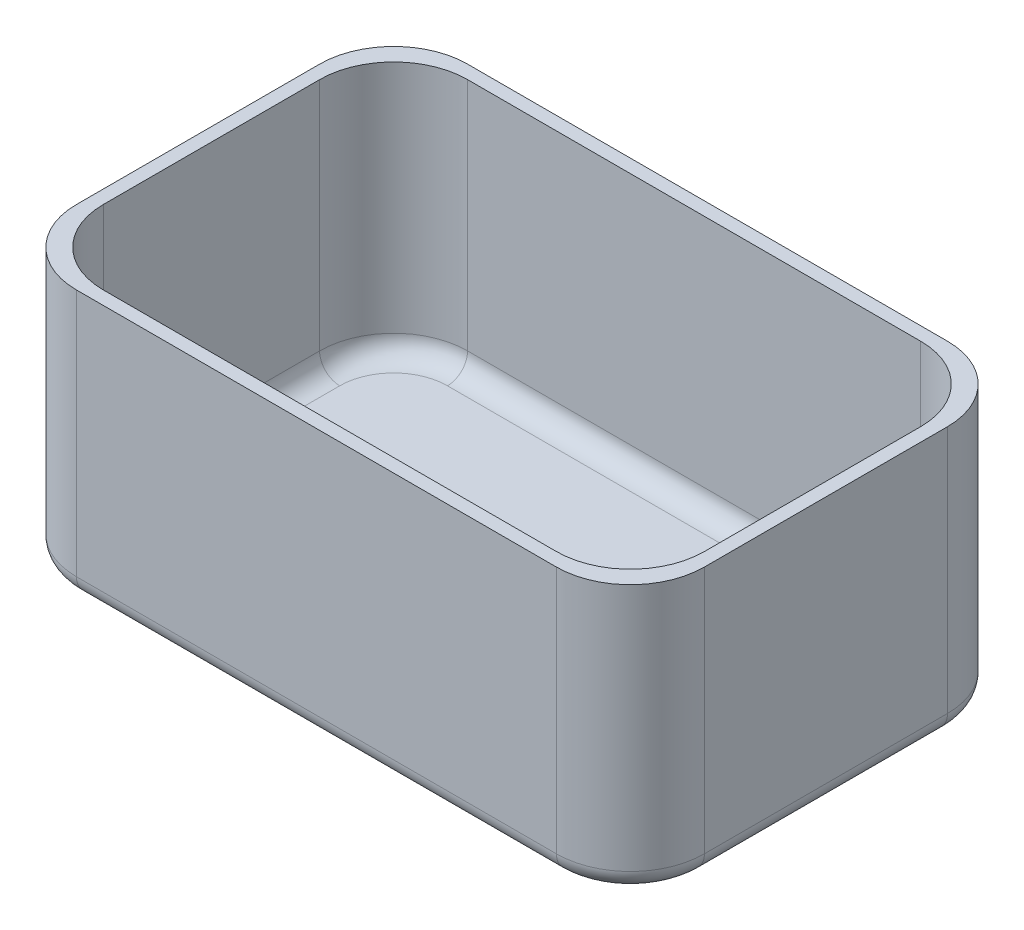
ISO-10303-21;
HEADER;
FILE_DESCRIPTION(('STEP AP214'),'2;1');
FILE_NAME('part.step','',(''),(''),'','','');
FILE_SCHEMA(('AUTOMOTIVE_DESIGN { 1 0 10303 214 1 1 1 1 }'));
ENDSEC;
DATA;
#1=APPLICATION_CONTEXT('core data for automotive mechanical design processes');
#2=APPLICATION_PROTOCOL_DEFINITION('international standard','automotive_design',2000,#1);
#3=PRODUCT_CONTEXT('',#1,'mechanical');
#4=PRODUCT('Part','Part','',(#3));
#5=PRODUCT_RELATED_PRODUCT_CATEGORY('part','',(#4));
#6=PRODUCT_DEFINITION_FORMATION('','',#4);
#7=PRODUCT_DEFINITION_CONTEXT('part definition',#1,'design');
#8=PRODUCT_DEFINITION('design','',#6,#7);
#9=PRODUCT_DEFINITION_SHAPE('','',#8);
#10=(LENGTH_UNIT() NAMED_UNIT(*) SI_UNIT(.MILLI.,.METRE.));
#11=(NAMED_UNIT(*) PLANE_ANGLE_UNIT() SI_UNIT($,.RADIAN.));
#12=(NAMED_UNIT(*) SI_UNIT($,.STERADIAN.) SOLID_ANGLE_UNIT());
#13=UNCERTAINTY_MEASURE_WITH_UNIT(LENGTH_MEASURE(1.E-05),#10,'distance_accuracy_value','');
#14=(GEOMETRIC_REPRESENTATION_CONTEXT(3) GLOBAL_UNCERTAINTY_ASSIGNED_CONTEXT((#13)) GLOBAL_UNIT_ASSIGNED_CONTEXT((#10,
#11,#12)) REPRESENTATION_CONTEXT('',''));
#15=CARTESIAN_POINT('',(0.,0.,0.));
#16=DIRECTION('',(0.,0.,1.));
#17=DIRECTION('',(1.,0.,0.));
#18=AXIS2_PLACEMENT_3D('',#15,#16,#17);
#19=CARTESIAN_POINT('',(287.475,9.52500000000001,0.));
#20=DIRECTION('',(0.,0.,-1.));
#21=DIRECTION('',(-1.,0.,0.));
#22=AXIS2_PLACEMENT_3D('',#19,#20,#21);
#23=CYLINDRICAL_SURFACE('',#22,9.525);
#24=CARTESIAN_POINT('',(287.475,9.52500000000001,-150.));
#25=DIRECTION('',(0.,0.,-1.));
#26=DIRECTION('',(-1.,0.,0.));
#27=AXIS2_PLACEMENT_3D('',#24,#25,#26);
#28=CIRCLE('',#27,9.525);
#29=CARTESIAN_POINT('',(297.,9.52500000000001,-150.));
#30=VERTEX_POINT('',#29);
#31=CARTESIAN_POINT('',(287.475,0.,-150.));
#32=VERTEX_POINT('',#31);
#33=EDGE_CURVE('E12',#30,#32,#28,.T.);
#34=ORIENTED_EDGE('',*,*,#33,.F.);
#35=DIRECTION('',(0.,0.,-1.));
#36=VECTOR('',#35,1.);
#37=CARTESIAN_POINT('',(297.,9.52500000000001,0.));
#38=LINE('',#37,#36);
#39=CARTESIAN_POINT('',(297.,9.52500000000001,-35.));
#40=VERTEX_POINT('',#39);
#41=EDGE_CURVE('E404',#40,#30,#38,.T.);
#42=ORIENTED_EDGE('',*,*,#41,.F.);
#43=CARTESIAN_POINT('',(287.475,9.52500000000001,-35.));
#44=DIRECTION('',(0.,0.,-1.));
#45=DIRECTION('',(-1.,0.,0.));
#46=AXIS2_PLACEMENT_3D('',#43,#44,#45);
#47=CIRCLE('',#46,9.525);
#48=CARTESIAN_POINT('',(287.475,0.,-35.));
#49=VERTEX_POINT('',#48);
#50=EDGE_CURVE('E53',#40,#49,#47,.T.);
#51=ORIENTED_EDGE('',*,*,#50,.T.);
#52=DIRECTION('',(0.,0.,-1.));
#53=VECTOR('',#52,1.);
#54=CARTESIAN_POINT('',(287.475,0.,0.));
#55=LINE('',#54,#53);
#56=EDGE_CURVE('E353',#32,#49,#55,.F.);
#57=ORIENTED_EDGE('',*,*,#56,.F.);
#58=EDGE_LOOP('',(#34,#42,#51,#57));
#59=FACE_BOUND('',#58,.T.);
#60=ADVANCED_FACE('F45',(#59),#23,.T.);
#61=CARTESIAN_POINT('',(262.,9.52500000000001,-35.));
#62=DIRECTION('',(0.,1.,0.));
#63=DIRECTION('',(0.,0.,1.));
#64=AXIS2_PLACEMENT_3D('',#61,#62,#63);
#65=TOROIDAL_SURFACE('',#64,25.475,9.525);
#66=ORIENTED_EDGE('',*,*,#50,.F.);
#67=CARTESIAN_POINT('',(262.,9.52500000000001,-35.));
#68=DIRECTION('',(0.,1.,0.));
#69=DIRECTION('',(0.,0.,1.));
#70=AXIS2_PLACEMENT_3D('',#67,#68,#69);
#71=CIRCLE('',#70,35.);
#72=CARTESIAN_POINT('',(262.,9.52500000000001,0.));
#73=VERTEX_POINT('',#72);
#74=EDGE_CURVE('E401',#73,#40,#71,.T.);
#75=ORIENTED_EDGE('',*,*,#74,.F.);
#76=CARTESIAN_POINT('',(262.,9.52500000000001,-9.525));
#77=DIRECTION('',(1.,0.,0.));
#78=DIRECTION('',(0.,0.,-1.));
#79=AXIS2_PLACEMENT_3D('',#76,#77,#78);
#80=CIRCLE('',#79,9.525);
#81=CARTESIAN_POINT('',(262.,0.,-9.525));
#82=VERTEX_POINT('',#81);
#83=EDGE_CURVE('E417',#73,#82,#80,.T.);
#84=ORIENTED_EDGE('',*,*,#83,.T.);
#85=CARTESIAN_POINT('',(262.,0.,-35.));
#86=DIRECTION('',(0.,1.,0.));
#87=DIRECTION('',(0.,0.,1.));
#88=AXIS2_PLACEMENT_3D('',#85,#86,#87);
#89=CIRCLE('',#88,25.475);
#90=EDGE_CURVE('E358',#49,#82,#89,.F.);
#91=ORIENTED_EDGE('',*,*,#90,.F.);
#92=EDGE_LOOP('',(#66,#75,#84,#91));
#93=FACE_BOUND('',#92,.T.);
#94=ADVANCED_FACE('F418',(#93),#65,.T.);
#95=CARTESIAN_POINT('',(0.,9.52500000000001,-9.525));
#96=DIRECTION('',(1.,0.,0.));
#97=DIRECTION('',(0.,0.,-1.));
#98=AXIS2_PLACEMENT_3D('',#95,#96,#97);
#99=CYLINDRICAL_SURFACE('',#98,9.525);
#100=ORIENTED_EDGE('',*,*,#83,.F.);
#101=DIRECTION('',(1.,0.,0.));
#102=VECTOR('',#101,1.);
#103=CARTESIAN_POINT('',(0.,9.52500000000001,0.));
#104=LINE('',#103,#102);
#105=CARTESIAN_POINT('',(35.,9.52500000000001,0.));
#106=VERTEX_POINT('',#105);
#107=EDGE_CURVE('E398',#106,#73,#104,.T.);
#108=ORIENTED_EDGE('',*,*,#107,.F.);
#109=CARTESIAN_POINT('',(35.,9.52500000000001,-9.525));
#110=DIRECTION('',(1.,0.,0.));
#111=DIRECTION('',(0.,0.,-1.));
#112=AXIS2_PLACEMENT_3D('',#109,#110,#111);
#113=CIRCLE('',#112,9.525);
#114=CARTESIAN_POINT('',(35.,0.,-9.525));
#115=VERTEX_POINT('',#114);
#116=EDGE_CURVE('E415',#106,#115,#113,.T.);
#117=ORIENTED_EDGE('',*,*,#116,.T.);
#118=DIRECTION('',(1.,0.,0.));
#119=VECTOR('',#118,1.);
#120=CARTESIAN_POINT('',(0.,0.,-9.525));
#121=LINE('',#120,#119);
#122=EDGE_CURVE('E361',#82,#115,#121,.F.);
#123=ORIENTED_EDGE('',*,*,#122,.F.);
#124=EDGE_LOOP('',(#100,#108,#117,#123));
#125=FACE_BOUND('',#124,.T.);
#126=ADVANCED_FACE('F563',(#125),#99,.T.);
#127=CARTESIAN_POINT('',(35.,9.52500000000001,-35.));
#128=DIRECTION('',(0.,1.,0.));
#129=DIRECTION('',(0.,0.,1.));
#130=AXIS2_PLACEMENT_3D('',#127,#128,#129);
#131=TOROIDAL_SURFACE('',#130,25.475,9.525);
#132=ORIENTED_EDGE('',*,*,#116,.F.);
#133=CARTESIAN_POINT('',(35.,9.52500000000001,-35.));
#134=DIRECTION('',(0.,1.,0.));
#135=DIRECTION('',(0.,0.,1.));
#136=AXIS2_PLACEMENT_3D('',#133,#134,#135);
#137=CIRCLE('',#136,35.);
#138=CARTESIAN_POINT('',(0.,9.52500000000001,-35.));
#139=VERTEX_POINT('',#138);
#140=EDGE_CURVE('E395',#139,#106,#137,.T.);
#141=ORIENTED_EDGE('',*,*,#140,.F.);
#142=CARTESIAN_POINT('',(9.525,9.52500000000001,-35.));
#143=DIRECTION('',(0.,0.,1.));
#144=DIRECTION('',(1.,0.,0.));
#145=AXIS2_PLACEMENT_3D('',#142,#143,#144);
#146=CIRCLE('',#145,9.525);
#147=CARTESIAN_POINT('',(9.525,0.,-35.));
#148=VERTEX_POINT('',#147);
#149=EDGE_CURVE('E413',#139,#148,#146,.T.);
#150=ORIENTED_EDGE('',*,*,#149,.T.);
#151=CARTESIAN_POINT('',(35.,0.,-35.));
#152=DIRECTION('',(0.,1.,0.));
#153=DIRECTION('',(0.,0.,1.));
#154=AXIS2_PLACEMENT_3D('',#151,#152,#153);
#155=CIRCLE('',#154,25.475);
#156=EDGE_CURVE('E364',#115,#148,#155,.F.);
#157=ORIENTED_EDGE('',*,*,#156,.F.);
#158=EDGE_LOOP('',(#132,#141,#150,#157));
#159=FACE_BOUND('',#158,.T.);
#160=ADVANCED_FACE('F568',(#159),#131,.T.);
#161=CARTESIAN_POINT('',(9.525,9.52500000000001,0.));
#162=DIRECTION('',(0.,0.,-1.));
#163=DIRECTION('',(-1.,0.,0.));
#164=AXIS2_PLACEMENT_3D('',#161,#162,#163);
#165=CYLINDRICAL_SURFACE('',#164,9.525);
#166=ORIENTED_EDGE('',*,*,#149,.F.);
#167=DIRECTION('',(0.,0.,1.));
#168=VECTOR('',#167,1.);
#169=CARTESIAN_POINT('',(0.,9.52500000000001,0.));
#170=LINE('',#169,#168);
#171=CARTESIAN_POINT('',(0.,9.52500000000001,-150.));
#172=VERTEX_POINT('',#171);
#173=EDGE_CURVE('E385',#172,#139,#170,.T.);
#174=ORIENTED_EDGE('',*,*,#173,.F.);
#175=CARTESIAN_POINT('',(9.525,9.52500000000001,-150.));
#176=DIRECTION('',(0.,0.,1.));
#177=DIRECTION('',(1.,0.,0.));
#178=AXIS2_PLACEMENT_3D('',#175,#176,#177);
#179=CIRCLE('',#178,9.525);
#180=CARTESIAN_POINT('',(9.525,0.,-150.));
#181=VERTEX_POINT('',#180);
#182=EDGE_CURVE('E409',#172,#181,#179,.T.);
#183=ORIENTED_EDGE('',*,*,#182,.T.);
#184=DIRECTION('',(0.,0.,1.));
#185=VECTOR('',#184,1.);
#186=CARTESIAN_POINT('',(9.525,0.,0.));
#187=LINE('',#186,#185);
#188=EDGE_CURVE('E367',#148,#181,#187,.F.);
#189=ORIENTED_EDGE('',*,*,#188,.F.);
#190=EDGE_LOOP('',(#166,#174,#183,#189));
#191=FACE_BOUND('',#190,.T.);
#192=ADVANCED_FACE('F572',(#191),#165,.T.);
#193=CARTESIAN_POINT('',(35.,9.52500000000001,-150.));
#194=DIRECTION('',(0.,1.,0.));
#195=DIRECTION('',(0.,0.,1.));
#196=AXIS2_PLACEMENT_3D('',#193,#194,#195);
#197=TOROIDAL_SURFACE('',#196,25.475,9.525);
#198=ORIENTED_EDGE('',*,*,#182,.F.);
#199=CARTESIAN_POINT('',(35.,9.52500000000001,-150.));
#200=DIRECTION('',(0.,1.,0.));
#201=DIRECTION('',(0.,0.,1.));
#202=AXIS2_PLACEMENT_3D('',#199,#200,#201);
#203=CIRCLE('',#202,35.);
#204=CARTESIAN_POINT('',(35.,9.52499999999998,-185.));
#205=VERTEX_POINT('',#204);
#206=EDGE_CURVE('E332',#205,#172,#203,.T.);
#207=ORIENTED_EDGE('',*,*,#206,.F.);
#208=CARTESIAN_POINT('',(35.,0.,-175.475));
#209=CARTESIAN_POINT('',(35.,0.,-185.));
#210=CARTESIAN_POINT('',(35.,9.52500000000001,-185.));
#211=(BOUNDED_CURVE() B_SPLINE_CURVE(2,(#208,#209,#210),.UNSPECIFIED.,.F.,
.F.) B_SPLINE_CURVE_WITH_KNOTS((3,3),(0.,1.),
.UNSPECIFIED.) CURVE() GEOMETRIC_REPRESENTATION_ITEM() RATIONAL_B_SPLINE_CURVE((1.,
0.707106781186547,1.)) REPRESENTATION_ITEM(''));
#212=CARTESIAN_POINT('',(34.9999999999976,0.,-175.475));
#213=VERTEX_POINT('',#212);
#214=EDGE_CURVE('E376',#213,#205,#211,.T.);
#215=ORIENTED_EDGE('',*,*,#214,.F.);
#216=CARTESIAN_POINT('',(35.,0.,-150.));
#217=DIRECTION('',(0.,1.,0.));
#218=DIRECTION('',(0.,0.,1.));
#219=AXIS2_PLACEMENT_3D('',#216,#217,#218);
#220=CIRCLE('',#219,25.475);
#221=EDGE_CURVE('E370',#181,#213,#220,.F.);
#222=ORIENTED_EDGE('',*,*,#221,.F.);
#223=EDGE_LOOP('',(#198,#207,#215,#222));
#224=FACE_BOUND('',#223,.T.);
#225=ADVANCED_FACE('F576',(#224),#197,.T.);
#226=CARTESIAN_POINT('',(262.,9.52500000000001,-150.));
#227=DIRECTION('',(0.,1.,0.));
#228=DIRECTION('',(0.,0.,1.));
#229=AXIS2_PLACEMENT_3D('',#226,#227,#228);
#230=TOROIDAL_SURFACE('',#229,25.475,9.525);
#231=CARTESIAN_POINT('',(262.,9.52500000000001,-150.));
#232=DIRECTION('',(0.,1.,0.));
#233=DIRECTION('',(0.,0.,1.));
#234=AXIS2_PLACEMENT_3D('',#231,#232,#233);
#235=CIRCLE('',#234,35.);
#236=CARTESIAN_POINT('',(262.,9.52500000000005,-185.));
#237=VERTEX_POINT('',#236);
#238=EDGE_CURVE('E407',#30,#237,#235,.T.);
#239=ORIENTED_EDGE('',*,*,#238,.F.);
#240=ORIENTED_EDGE('',*,*,#33,.T.);
#241=CARTESIAN_POINT('',(262.,0.,-150.));
#242=DIRECTION('',(0.,1.,0.));
#243=DIRECTION('',(0.,0.,1.));
#244=AXIS2_PLACEMENT_3D('',#241,#242,#243);
#245=CIRCLE('',#244,25.475);
#246=CARTESIAN_POINT('',(261.999999999815,0.,-175.475));
#247=VERTEX_POINT('',#246);
#248=EDGE_CURVE('E340',#247,#32,#245,.F.);
#249=ORIENTED_EDGE('',*,*,#248,.F.);
#250=CARTESIAN_POINT('',(262.,0.,-175.475));
#251=CARTESIAN_POINT('',(262.,0.,-185.));
#252=CARTESIAN_POINT('',(262.,9.52500000000001,-185.));
#253=(BOUNDED_CURVE() B_SPLINE_CURVE(2,(#250,#251,#252),.UNSPECIFIED.,.F.,
.F.) B_SPLINE_CURVE_WITH_KNOTS((3,3),(0.,1.),
.UNSPECIFIED.) CURVE() GEOMETRIC_REPRESENTATION_ITEM() RATIONAL_B_SPLINE_CURVE((1.,
0.707106781186547,1.)) REPRESENTATION_ITEM(''));
#254=EDGE_CURVE('E372',#237,#247,#253,.F.);
#255=ORIENTED_EDGE('',*,*,#254,.F.);
#256=EDGE_LOOP('',(#239,#240,#249,#255));
#257=FACE_BOUND('',#256,.T.);
#258=ADVANCED_FACE('F47',(#257),#230,.T.);
#259=CARTESIAN_POINT('',(-16.5006092839274,0.,-175.475));
#260=CARTESIAN_POINT('',(-7.33390876651765,0.,-175.475));
#261=CARTESIAN_POINT('',(1.83279175088029,0.,-175.475));
#262=CARTESIAN_POINT('',(102.6664974424,0.,-175.475));
#263=CARTESIAN_POINT('',(194.333502615845,0.,-175.475));
#264=CARTESIAN_POINT('',(295.167208307941,0.,-175.475));
#265=CARTESIAN_POINT('',(304.333908825247,0.,-175.475));
#266=CARTESIAN_POINT('',(313.500609342696,0.,-175.475));
#267=CARTESIAN_POINT('',(-16.5006092839274,0.,-185.));
#268=CARTESIAN_POINT('',(-7.33390876651765,0.,-185.));
#269=CARTESIAN_POINT('',(1.83279175088029,0.,-185.));
#270=CARTESIAN_POINT('',(102.6664974424,0.,-185.));
#271=CARTESIAN_POINT('',(194.333502615845,0.,-185.));
#272=CARTESIAN_POINT('',(295.167208307941,0.,-185.));
#273=CARTESIAN_POINT('',(304.333908825247,0.,-185.));
#274=CARTESIAN_POINT('',(313.500609342696,0.,-185.));
#275=CARTESIAN_POINT('',(-16.5006092839274,9.52500000000001,-185.));
#276=CARTESIAN_POINT('',(-7.33390876651765,9.52500000000001,-185.));
#277=CARTESIAN_POINT('',(1.83279175088029,9.52500000000001,-185.));
#278=CARTESIAN_POINT('',(102.6664974424,9.52500000000001,-185.));
#279=CARTESIAN_POINT('',(194.333502615845,9.52500000000001,-185.));
#280=CARTESIAN_POINT('',(295.167208307941,9.52500000000001,-185.));
#281=CARTESIAN_POINT('',(304.333908825247,9.52500000000001,-185.));
#282=CARTESIAN_POINT('',(313.500609342696,9.52500000000001,-185.));
#283=(BOUNDED_SURFACE() B_SPLINE_SURFACE(2,3,((#259,#260,#261,#262,#263,#264,#265,#266),(#267,
#268,#269,#270,#271,#272,#273,#274),(#275,#276,#277,#278,#279,#280,#281,#282)),.UNSPECIFIED.,
.F.,.F.,.F.) B_SPLINE_SURFACE_WITH_KNOTS((3,3),(4,2,2,4),(0.,1.),(-0.2268749307662,
-0.105729108950259,1.10572910920915,1.22687493102509),
.UNSPECIFIED.) GEOMETRIC_REPRESENTATION_ITEM() RATIONAL_B_SPLINE_SURFACE(((1.,1.,1.,1.,1.,1.,1.,
1.),(0.707106781186547,0.707106781186547,0.707106781186547,0.707106781186547,0.707106781186547,
0.707106781186547,0.707106781186547,0.707106781186547),(1.,1.,1.,1.,1.,1.,1.,1.))) REPRESENTATION_ITEM('') SURFACE());
#284=CARTESIAN_POINT('',(313.500609342696,0.,-175.475));
#285=CARTESIAN_POINT('',(304.333908825247,0.,-175.475));
#286=CARTESIAN_POINT('',(295.167208307941,0.,-175.475));
#287=CARTESIAN_POINT('',(194.333502615845,0.,-175.475));
#288=CARTESIAN_POINT('',(102.6664974424,0.,-175.475));
#289=CARTESIAN_POINT('',(1.83279175088029,0.,-175.475));
#290=CARTESIAN_POINT('',(-7.33390876651765,0.,-175.475));
#291=CARTESIAN_POINT('',(-16.5006092839274,0.,-175.475));
#292=(BOUNDED_CURVE() B_SPLINE_CURVE(3,(#284,#285,#286,#287,#288,#289,#290,#291),.UNSPECIFIED.,
.F.,.F.) B_SPLINE_CURVE_WITH_KNOTS((4,2,2,4),(-0.2268749307662,-0.105729108950259,
1.10572910920915,1.22687493102509),
.UNSPECIFIED.) CURVE() GEOMETRIC_REPRESENTATION_ITEM() RATIONAL_B_SPLINE_CURVE((1.,1.,1.,1.,1.,
1.,1.,1.)) REPRESENTATION_ITEM(''));
#293=EDGE_CURVE('E349',#213,#247,#292,.F.);
#294=CARTESIAN_POINT('',(-16.5006092839274,9.52500000000001,-185.));
#295=CARTESIAN_POINT('',(-7.33390876651765,9.52500000000001,-185.));
#296=CARTESIAN_POINT('',(1.83279175088029,9.52500000000001,-185.));
#297=CARTESIAN_POINT('',(102.6664974424,9.52500000000001,-185.));
#298=CARTESIAN_POINT('',(194.333502615845,9.52500000000001,-185.));
#299=CARTESIAN_POINT('',(295.167208307941,9.52500000000001,-185.));
#300=CARTESIAN_POINT('',(304.333908825247,9.52500000000001,-185.));
#301=CARTESIAN_POINT('',(313.500609342696,9.52500000000001,-185.));
#302=(BOUNDED_CURVE() B_SPLINE_CURVE(3,(#294,#295,#296,#297,#298,#299,#300,#301),.UNSPECIFIED.,
.F.,.F.) B_SPLINE_CURVE_WITH_KNOTS((4,2,2,4),(-0.2268749307662,-0.105729108950259,
1.10572910920915,1.22687493102509),
.UNSPECIFIED.) CURVE() GEOMETRIC_REPRESENTATION_ITEM() RATIONAL_B_SPLINE_CURVE((1.,1.,1.,1.,1.,
1.,1.,1.)) REPRESENTATION_ITEM(''));
#303=EDGE_CURVE('E302',#237,#205,#302,.F.);
#304=ORIENTED_EDGE('',*,*,#293,.F.);
#305=ORIENTED_EDGE('',*,*,#214,.T.);
#306=ORIENTED_EDGE('',*,*,#303,.F.);
#307=ORIENTED_EDGE('',*,*,#254,.T.);
#308=EDGE_LOOP('',(#304,#305,#306,#307));
#309=FACE_BOUND('',#308,.T.);
#310=ADVANCED_FACE('F581',(#309),#283,.T.);
#311=CARTESIAN_POINT('',(0.,15.875,-169.125));
#312=DIRECTION('',(-1.,0.,0.));
#313=DIRECTION('',(0.,0.,1.));
#314=AXIS2_PLACEMENT_3D('',#311,#312,#313);
#315=CYLINDRICAL_SURFACE('',#314,9.525);
#316=CARTESIAN_POINT('',(41.35,15.875,-169.125));
#317=DIRECTION('',(1.,0.,0.));
#318=DIRECTION('',(0.,0.,-1.));
#319=AXIS2_PLACEMENT_3D('',#316,#317,#318);
#320=CIRCLE('',#319,9.525);
#321=CARTESIAN_POINT('',(41.35,6.35,-169.125));
#322=VERTEX_POINT('',#321);
#323=CARTESIAN_POINT('',(41.35,15.875,-178.65));
#324=VERTEX_POINT('',#323);
#325=EDGE_CURVE('E497',#322,#324,#320,.T.);
#326=ORIENTED_EDGE('',*,*,#325,.F.);
#327=DIRECTION('',(-1.,0.,0.));
#328=VECTOR('',#327,1.);
#329=CARTESIAN_POINT('',(0.,6.35,-169.125));
#330=LINE('',#329,#328);
#331=CARTESIAN_POINT('',(255.65,6.35,-169.125));
#332=VERTEX_POINT('',#331);
#333=EDGE_CURVE('E436',#332,#322,#330,.T.);
#334=ORIENTED_EDGE('',*,*,#333,.F.);
#335=CARTESIAN_POINT('',(255.65,15.875,-169.125));
#336=DIRECTION('',(1.,0.,0.));
#337=DIRECTION('',(0.,0.,-1.));
#338=AXIS2_PLACEMENT_3D('',#335,#336,#337);
#339=CIRCLE('',#338,9.525);
#340=CARTESIAN_POINT('',(255.65,15.875,-178.65));
#341=VERTEX_POINT('',#340);
#342=EDGE_CURVE('E496',#332,#341,#339,.T.);
#343=ORIENTED_EDGE('',*,*,#342,.T.);
#344=DIRECTION('',(-1.,0.,0.));
#345=VECTOR('',#344,1.);
#346=CARTESIAN_POINT('',(0.,15.875,-178.65));
#347=LINE('',#346,#345);
#348=EDGE_CURVE('E482',#324,#341,#347,.F.);
#349=ORIENTED_EDGE('',*,*,#348,.F.);
#350=EDGE_LOOP('',(#326,#334,#343,#349));
#351=FACE_BOUND('',#350,.T.);
#352=ADVANCED_FACE('F504',(#351),#315,.F.);
#353=CARTESIAN_POINT('',(255.65,15.875,-143.65));
#354=DIRECTION('',(0.,1.,0.));
#355=DIRECTION('',(0.,0.,1.));
#356=AXIS2_PLACEMENT_3D('',#353,#354,#355);
#357=TOROIDAL_SURFACE('',#356,25.475,9.525);
#358=ORIENTED_EDGE('',*,*,#342,.F.);
#359=CARTESIAN_POINT('',(255.65,6.35,-143.65));
#360=DIRECTION('',(0.,1.,0.));
#361=DIRECTION('',(0.,0.,1.));
#362=AXIS2_PLACEMENT_3D('',#359,#360,#361);
#363=CIRCLE('',#362,25.475);
#364=CARTESIAN_POINT('',(281.125,6.35,-143.65));
#365=VERTEX_POINT('',#364);
#366=EDGE_CURVE('E442',#365,#332,#363,.T.);
#367=ORIENTED_EDGE('',*,*,#366,.F.);
#368=CARTESIAN_POINT('',(281.125,15.875,-143.65));
#369=DIRECTION('',(0.,0.,1.));
#370=DIRECTION('',(1.,0.,0.));
#371=AXIS2_PLACEMENT_3D('',#368,#369,#370);
#372=CIRCLE('',#371,9.525);
#373=CARTESIAN_POINT('',(290.65,15.875,-143.65));
#374=VERTEX_POINT('',#373);
#375=EDGE_CURVE('E494',#365,#374,#372,.T.);
#376=ORIENTED_EDGE('',*,*,#375,.T.);
#377=CARTESIAN_POINT('',(255.65,15.875,-143.65));
#378=DIRECTION('',(0.,1.,0.));
#379=DIRECTION('',(0.,0.,1.));
#380=AXIS2_PLACEMENT_3D('',#377,#378,#379);
#381=CIRCLE('',#380,35.);
#382=EDGE_CURVE('E479',#341,#374,#381,.F.);
#383=ORIENTED_EDGE('',*,*,#382,.F.);
#384=EDGE_LOOP('',(#358,#367,#376,#383));
#385=FACE_BOUND('',#384,.T.);
#386=ADVANCED_FACE('F507',(#385),#357,.F.);
#387=CARTESIAN_POINT('',(281.125,15.875,0.));
#388=DIRECTION('',(0.,0.,1.));
#389=DIRECTION('',(1.,0.,0.));
#390=AXIS2_PLACEMENT_3D('',#387,#388,#389);
#391=CYLINDRICAL_SURFACE('',#390,9.525);
#392=ORIENTED_EDGE('',*,*,#375,.F.);
#393=DIRECTION('',(0.,0.,-1.));
#394=VECTOR('',#393,1.);
#395=CARTESIAN_POINT('',(281.125,6.35,0.));
#396=LINE('',#395,#394);
#397=CARTESIAN_POINT('',(281.125,6.35,-41.35));
#398=VERTEX_POINT('',#397);
#399=EDGE_CURVE('E445',#398,#365,#396,.T.);
#400=ORIENTED_EDGE('',*,*,#399,.F.);
#401=CARTESIAN_POINT('',(281.125,15.875,-41.35));
#402=DIRECTION('',(0.,0.,1.));
#403=DIRECTION('',(1.,0.,0.));
#404=AXIS2_PLACEMENT_3D('',#401,#402,#403);
#405=CIRCLE('',#404,9.525);
#406=CARTESIAN_POINT('',(290.65,15.875,-41.35));
#407=VERTEX_POINT('',#406);
#408=EDGE_CURVE('E492',#398,#407,#405,.T.);
#409=ORIENTED_EDGE('',*,*,#408,.T.);
#410=DIRECTION('',(0.,0.,-1.));
#411=VECTOR('',#410,1.);
#412=CARTESIAN_POINT('',(290.65,15.875,0.));
#413=LINE('',#412,#411);
#414=EDGE_CURVE('E476',#374,#407,#413,.F.);
#415=ORIENTED_EDGE('',*,*,#414,.F.);
#416=EDGE_LOOP('',(#392,#400,#409,#415));
#417=FACE_BOUND('',#416,.T.);
#418=ADVANCED_FACE('F543',(#417),#391,.F.);
#419=CARTESIAN_POINT('',(255.65,15.875,-41.35));
#420=DIRECTION('',(0.,1.,0.));
#421=DIRECTION('',(0.,0.,1.));
#422=AXIS2_PLACEMENT_3D('',#419,#420,#421);
#423=TOROIDAL_SURFACE('',#422,25.475,9.525);
#424=ORIENTED_EDGE('',*,*,#408,.F.);
#425=CARTESIAN_POINT('',(255.65,6.35,-41.35));
#426=DIRECTION('',(0.,1.,0.));
#427=DIRECTION('',(0.,0.,1.));
#428=AXIS2_PLACEMENT_3D('',#425,#426,#427);
#429=CIRCLE('',#428,25.475);
#430=CARTESIAN_POINT('',(255.65,6.35,-15.875));
#431=VERTEX_POINT('',#430);
#432=EDGE_CURVE('E448',#431,#398,#429,.T.);
#433=ORIENTED_EDGE('',*,*,#432,.F.);
#434=CARTESIAN_POINT('',(255.65,15.875,-15.875));
#435=DIRECTION('',(-1.,0.,0.));
#436=DIRECTION('',(0.,0.,1.));
#437=AXIS2_PLACEMENT_3D('',#434,#435,#436);
#438=CIRCLE('',#437,9.525);
#439=CARTESIAN_POINT('',(255.65,15.875,-6.35));
#440=VERTEX_POINT('',#439);
#441=EDGE_CURVE('E490',#431,#440,#438,.T.);
#442=ORIENTED_EDGE('',*,*,#441,.T.);
#443=CARTESIAN_POINT('',(255.65,15.875,-41.35));
#444=DIRECTION('',(0.,1.,0.));
#445=DIRECTION('',(0.,0.,1.));
#446=AXIS2_PLACEMENT_3D('',#443,#444,#445);
#447=CIRCLE('',#446,35.);
#448=EDGE_CURVE('E473',#407,#440,#447,.F.);
#449=ORIENTED_EDGE('',*,*,#448,.F.);
#450=EDGE_LOOP('',(#424,#433,#442,#449));
#451=FACE_BOUND('',#450,.T.);
#452=ADVANCED_FACE('F545',(#451),#423,.F.);
#453=CARTESIAN_POINT('',(0.,15.875,-15.875));
#454=DIRECTION('',(-1.,0.,0.));
#455=DIRECTION('',(0.,0.,1.));
#456=AXIS2_PLACEMENT_3D('',#453,#454,#455);
#457=CYLINDRICAL_SURFACE('',#456,9.525);
#458=ORIENTED_EDGE('',*,*,#441,.F.);
#459=DIRECTION('',(1.,0.,0.));
#460=VECTOR('',#459,1.);
#461=CARTESIAN_POINT('',(0.,6.35,-15.875));
#462=LINE('',#461,#460);
#463=CARTESIAN_POINT('',(41.35,6.35,-15.875));
#464=VERTEX_POINT('',#463);
#465=EDGE_CURVE('E451',#464,#431,#462,.T.);
#466=ORIENTED_EDGE('',*,*,#465,.F.);
#467=CARTESIAN_POINT('',(41.35,15.875,-15.875));
#468=DIRECTION('',(-1.,0.,0.));
#469=DIRECTION('',(0.,0.,1.));
#470=AXIS2_PLACEMENT_3D('',#467,#468,#469);
#471=CIRCLE('',#470,9.525);
#472=CARTESIAN_POINT('',(41.35,15.875,-6.35));
#473=VERTEX_POINT('',#472);
#474=EDGE_CURVE('E488',#464,#473,#471,.T.);
#475=ORIENTED_EDGE('',*,*,#474,.T.);
#476=DIRECTION('',(1.,0.,0.));
#477=VECTOR('',#476,1.);
#478=CARTESIAN_POINT('',(0.,15.875,-6.35));
#479=LINE('',#478,#477);
#480=EDGE_CURVE('E470',#440,#473,#479,.F.);
#481=ORIENTED_EDGE('',*,*,#480,.F.);
#482=EDGE_LOOP('',(#458,#466,#475,#481));
#483=FACE_BOUND('',#482,.T.);
#484=ADVANCED_FACE('F548',(#483),#457,.F.);
#485=CARTESIAN_POINT('',(41.35,15.875,-41.35));
#486=DIRECTION('',(0.,1.,0.));
#487=DIRECTION('',(0.,0.,1.));
#488=AXIS2_PLACEMENT_3D('',#485,#486,#487);
#489=TOROIDAL_SURFACE('',#488,25.475,9.525);
#490=ORIENTED_EDGE('',*,*,#474,.F.);
#491=CARTESIAN_POINT('',(41.35,6.35,-41.35));
#492=DIRECTION('',(0.,1.,0.));
#493=DIRECTION('',(0.,0.,1.));
#494=AXIS2_PLACEMENT_3D('',#491,#492,#493);
#495=CIRCLE('',#494,25.475);
#496=CARTESIAN_POINT('',(15.875,6.35,-41.35));
#497=VERTEX_POINT('',#496);
#498=EDGE_CURVE('E454',#497,#464,#495,.T.);
#499=ORIENTED_EDGE('',*,*,#498,.F.);
#500=CARTESIAN_POINT('',(15.875,15.875,-41.35));
#501=DIRECTION('',(0.,0.,-1.));
#502=DIRECTION('',(-1.,0.,0.));
#503=AXIS2_PLACEMENT_3D('',#500,#501,#502);
#504=CIRCLE('',#503,9.525);
#505=CARTESIAN_POINT('',(6.35,15.875,-41.35));
#506=VERTEX_POINT('',#505);
#507=EDGE_CURVE('E486',#497,#506,#504,.T.);
#508=ORIENTED_EDGE('',*,*,#507,.T.);
#509=CARTESIAN_POINT('',(41.35,15.875,-41.35));
#510=DIRECTION('',(0.,1.,0.));
#511=DIRECTION('',(0.,0.,1.));
#512=AXIS2_PLACEMENT_3D('',#509,#510,#511);
#513=CIRCLE('',#512,35.);
#514=EDGE_CURVE('E467',#473,#506,#513,.F.);
#515=ORIENTED_EDGE('',*,*,#514,.F.);
#516=EDGE_LOOP('',(#490,#499,#508,#515));
#517=FACE_BOUND('',#516,.T.);
#518=ADVANCED_FACE('F550',(#517),#489,.F.);
#519=CARTESIAN_POINT('',(15.875,15.875,0.));
#520=DIRECTION('',(0.,0.,1.));
#521=DIRECTION('',(1.,0.,0.));
#522=AXIS2_PLACEMENT_3D('',#519,#520,#521);
#523=CYLINDRICAL_SURFACE('',#522,9.525);
#524=ORIENTED_EDGE('',*,*,#507,.F.);
#525=DIRECTION('',(0.,0.,1.));
#526=VECTOR('',#525,1.);
#527=CARTESIAN_POINT('',(15.875,6.35,0.));
#528=LINE('',#527,#526);
#529=CARTESIAN_POINT('',(15.875,6.35,-143.65));
#530=VERTEX_POINT('',#529);
#531=EDGE_CURVE('E457',#530,#497,#528,.T.);
#532=ORIENTED_EDGE('',*,*,#531,.F.);
#533=CARTESIAN_POINT('',(15.875,15.875,-143.65));
#534=DIRECTION('',(0.,0.,-1.));
#535=DIRECTION('',(-1.,0.,0.));
#536=AXIS2_PLACEMENT_3D('',#533,#534,#535);
#537=CIRCLE('',#536,9.525);
#538=CARTESIAN_POINT('',(6.35,15.875,-143.65));
#539=VERTEX_POINT('',#538);
#540=EDGE_CURVE('E484',#530,#539,#537,.T.);
#541=ORIENTED_EDGE('',*,*,#540,.T.);
#542=DIRECTION('',(0.,0.,1.));
#543=VECTOR('',#542,1.);
#544=CARTESIAN_POINT('',(6.35,15.875,0.));
#545=LINE('',#544,#543);
#546=EDGE_CURVE('E464',#506,#539,#545,.F.);
#547=ORIENTED_EDGE('',*,*,#546,.F.);
#548=EDGE_LOOP('',(#524,#532,#541,#547));
#549=FACE_BOUND('',#548,.T.);
#550=ADVANCED_FACE('F535',(#549),#523,.F.);
#551=CARTESIAN_POINT('',(41.35,15.875,-143.65));
#552=DIRECTION('',(0.,1.,0.));
#553=DIRECTION('',(0.,0.,1.));
#554=AXIS2_PLACEMENT_3D('',#551,#552,#553);
#555=TOROIDAL_SURFACE('',#554,25.475,9.525);
#556=CARTESIAN_POINT('',(41.35,6.35,-143.65));
#557=DIRECTION('',(0.,1.,0.));
#558=DIRECTION('',(0.,0.,1.));
#559=AXIS2_PLACEMENT_3D('',#556,#557,#558);
#560=CIRCLE('',#559,25.475);
#561=EDGE_CURVE('E460',#322,#530,#560,.T.);
#562=ORIENTED_EDGE('',*,*,#561,.F.);
#563=ORIENTED_EDGE('',*,*,#325,.T.);
#564=CARTESIAN_POINT('',(41.35,15.875,-143.65));
#565=DIRECTION('',(0.,1.,0.));
#566=DIRECTION('',(0.,0.,1.));
#567=AXIS2_PLACEMENT_3D('',#564,#565,#566);
#568=CIRCLE('',#567,35.);
#569=EDGE_CURVE('E224',#539,#324,#568,.F.);
#570=ORIENTED_EDGE('',*,*,#569,.F.);
#571=ORIENTED_EDGE('',*,*,#540,.F.);
#572=EDGE_LOOP('',(#562,#563,#570,#571));
#573=FACE_BOUND('',#572,.T.);
#574=ADVANCED_FACE('F501',(#573),#555,.F.);
#575=CARTESIAN_POINT('',(262.,127.,-150.));
#576=DIRECTION('',(0.,1.,0.));
#577=DIRECTION('',(0.,0.,1.));
#578=AXIS2_PLACEMENT_3D('',#575,#576,#577);
#579=CYLINDRICAL_SURFACE('',#578,35.);
#580=DIRECTION('',(0.,-1.,0.));
#581=VECTOR('',#580,1.);
#582=CARTESIAN_POINT('',(297.,127.,-150.));
#583=LINE('',#582,#581);
#584=CARTESIAN_POINT('',(297.,127.,-150.));
#585=VERTEX_POINT('',#584);
#586=EDGE_CURVE('E429',#30,#585,#583,.F.);
#587=ORIENTED_EDGE('',*,*,#586,.F.);
#588=ORIENTED_EDGE('',*,*,#238,.T.);
#589=CARTESIAN_POINT('',(262.,127.,-185.));
#590=DIRECTION('',(0.,-1.,0.));
#591=VECTOR('',#590,1.);
#592=LINE('',#589,#591);
#593=CARTESIAN_POINT('',(262.,127.,-185.));
#594=VERTEX_POINT('',#593);
#595=EDGE_CURVE('E434',#594,#237,#592,.T.);
#596=ORIENTED_EDGE('',*,*,#595,.F.);
#597=CARTESIAN_POINT('',(262.,127.,-150.));
#598=DIRECTION('',(0.,1.,0.));
#599=DIRECTION('',(0.,0.,1.));
#600=AXIS2_PLACEMENT_3D('',#597,#598,#599);
#601=CIRCLE('',#600,35.);
#602=EDGE_CURVE('E433',#585,#594,#601,.T.);
#603=ORIENTED_EDGE('',*,*,#602,.F.);
#604=EDGE_LOOP('',(#587,#588,#596,#603));
#605=FACE_BOUND('',#604,.T.);
#606=ADVANCED_FACE('F432',(#605),#579,.T.);
#607=CARTESIAN_POINT('',(35.,127.,-150.));
#608=DIRECTION('',(0.,1.,0.));
#609=DIRECTION('',(0.,0.,1.));
#610=AXIS2_PLACEMENT_3D('',#607,#608,#609);
#611=CYLINDRICAL_SURFACE('',#610,35.);
#612=DIRECTION('',(0.,1.,0.));
#613=VECTOR('',#612,1.);
#614=CARTESIAN_POINT('',(35.,127.,-185.));
#615=LINE('',#614,#613);
#616=CARTESIAN_POINT('',(35.,127.,-185.));
#617=VERTEX_POINT('',#616);
#618=EDGE_CURVE('E285',#205,#617,#615,.T.);
#619=ORIENTED_EDGE('',*,*,#618,.F.);
#620=ORIENTED_EDGE('',*,*,#206,.T.);
#621=DIRECTION('',(0.,1.,0.));
#622=VECTOR('',#621,1.);
#623=CARTESIAN_POINT('',(0.,127.,-150.));
#624=LINE('',#623,#622);
#625=CARTESIAN_POINT('',(0.,127.,-150.));
#626=VERTEX_POINT('',#625);
#627=EDGE_CURVE('E288',#626,#172,#624,.F.);
#628=ORIENTED_EDGE('',*,*,#627,.F.);
#629=CARTESIAN_POINT('',(35.,127.,-150.));
#630=DIRECTION('',(0.,1.,0.));
#631=DIRECTION('',(0.,0.,1.));
#632=AXIS2_PLACEMENT_3D('',#629,#630,#631);
#633=CIRCLE('',#632,35.);
#634=EDGE_CURVE('E438',#617,#626,#633,.T.);
#635=ORIENTED_EDGE('',*,*,#634,.F.);
#636=EDGE_LOOP('',(#619,#620,#628,#635));
#637=FACE_BOUND('',#636,.T.);
#638=ADVANCED_FACE('F620',(#637),#611,.T.);
#639=CARTESIAN_POINT('',(35.,127.,-35.));
#640=DIRECTION('',(0.,1.,0.));
#641=DIRECTION('',(0.,0.,1.));
#642=AXIS2_PLACEMENT_3D('',#639,#640,#641);
#643=CYLINDRICAL_SURFACE('',#642,35.);
#644=DIRECTION('',(0.,-1.,0.));
#645=VECTOR('',#644,1.);
#646=CARTESIAN_POINT('',(0.,127.,-35.));
#647=LINE('',#646,#645);
#648=CARTESIAN_POINT('',(0.,127.,-35.));
#649=VERTEX_POINT('',#648);
#650=EDGE_CURVE('E281',#139,#649,#647,.F.);
#651=ORIENTED_EDGE('',*,*,#650,.F.);
#652=ORIENTED_EDGE('',*,*,#140,.T.);
#653=DIRECTION('',(0.,-1.,0.));
#654=VECTOR('',#653,1.);
#655=CARTESIAN_POINT('',(35.,127.,0.));
#656=LINE('',#655,#654);
#657=CARTESIAN_POINT('',(35.,127.,0.));
#658=VERTEX_POINT('',#657);
#659=EDGE_CURVE('E278',#658,#106,#656,.T.);
#660=ORIENTED_EDGE('',*,*,#659,.F.);
#661=CARTESIAN_POINT('',(35.,127.,-35.));
#662=DIRECTION('',(0.,1.,0.));
#663=DIRECTION('',(0.,0.,1.));
#664=AXIS2_PLACEMENT_3D('',#661,#662,#663);
#665=CIRCLE('',#664,35.);
#666=EDGE_CURVE('E283',#649,#658,#665,.T.);
#667=ORIENTED_EDGE('',*,*,#666,.F.);
#668=EDGE_LOOP('',(#651,#652,#660,#667));
#669=FACE_BOUND('',#668,.T.);
#670=ADVANCED_FACE('F639',(#669),#643,.T.);
#671=CARTESIAN_POINT('',(262.,127.,-35.));
#672=DIRECTION('',(0.,1.,0.));
#673=DIRECTION('',(0.,0.,1.));
#674=AXIS2_PLACEMENT_3D('',#671,#672,#673);
#675=CYLINDRICAL_SURFACE('',#674,35.);
#676=DIRECTION('',(0.,1.,0.));
#677=VECTOR('',#676,1.);
#678=CARTESIAN_POINT('',(262.,127.,0.));
#679=LINE('',#678,#677);
#680=CARTESIAN_POINT('',(262.,127.,0.));
#681=VERTEX_POINT('',#680);
#682=EDGE_CURVE('E271',#73,#681,#679,.T.);
#683=ORIENTED_EDGE('',*,*,#682,.F.);
#684=ORIENTED_EDGE('',*,*,#74,.T.);
#685=DIRECTION('',(0.,1.,0.));
#686=VECTOR('',#685,1.);
#687=CARTESIAN_POINT('',(297.,127.,-35.));
#688=LINE('',#687,#686);
#689=CARTESIAN_POINT('',(297.,127.,-35.));
#690=VERTEX_POINT('',#689);
#691=EDGE_CURVE('E273',#690,#40,#688,.F.);
#692=ORIENTED_EDGE('',*,*,#691,.F.);
#693=CARTESIAN_POINT('',(262.,127.,-35.));
#694=DIRECTION('',(0.,1.,0.));
#695=DIRECTION('',(0.,0.,1.));
#696=AXIS2_PLACEMENT_3D('',#693,#694,#695);
#697=CIRCLE('',#696,35.);
#698=EDGE_CURVE('E276',#681,#690,#697,.T.);
#699=ORIENTED_EDGE('',*,*,#698,.F.);
#700=EDGE_LOOP('',(#683,#684,#692,#699));
#701=FACE_BOUND('',#700,.T.);
#702=ADVANCED_FACE('F646',(#701),#675,.T.);
#703=CARTESIAN_POINT('',(255.65,127.,-41.35));
#704=DIRECTION('',(0.,-1.,0.));
#705=DIRECTION('',(0.,0.,-1.));
#706=AXIS2_PLACEMENT_3D('',#703,#704,#705);
#707=CYLINDRICAL_SURFACE('',#706,35.);
#708=DIRECTION('',(0.,1.,0.));
#709=VECTOR('',#708,1.);
#710=CARTESIAN_POINT('',(290.65,127.,-41.35));
#711=LINE('',#710,#709);
#712=CARTESIAN_POINT('',(290.65,127.,-41.35));
#713=VERTEX_POINT('',#712);
#714=EDGE_CURVE('E263',#407,#713,#711,.T.);
#715=ORIENTED_EDGE('',*,*,#714,.F.);
#716=ORIENTED_EDGE('',*,*,#448,.T.);
#717=DIRECTION('',(0.,1.,0.));
#718=VECTOR('',#717,1.);
#719=CARTESIAN_POINT('',(255.65,127.,-6.35));
#720=LINE('',#719,#718);
#721=CARTESIAN_POINT('',(255.65,127.,-6.35));
#722=VERTEX_POINT('',#721);
#723=EDGE_CURVE('E265',#722,#440,#720,.F.);
#724=ORIENTED_EDGE('',*,*,#723,.F.);
#725=CARTESIAN_POINT('',(255.65,127.,-41.35));
#726=DIRECTION('',(0.,1.,0.));
#727=DIRECTION('',(0.,0.,1.));
#728=AXIS2_PLACEMENT_3D('',#725,#726,#727);
#729=CIRCLE('',#728,35.);
#730=EDGE_CURVE('E268',#722,#713,#729,.T.);
#731=ORIENTED_EDGE('',*,*,#730,.T.);
#732=EDGE_LOOP('',(#715,#716,#724,#731));
#733=FACE_BOUND('',#732,.T.);
#734=ADVANCED_FACE('F521',(#733),#707,.F.);
#735=CARTESIAN_POINT('',(41.35,127.,-41.35));
#736=DIRECTION('',(0.,-1.,0.));
#737=DIRECTION('',(0.,0.,-1.));
#738=AXIS2_PLACEMENT_3D('',#735,#736,#737);
#739=CYLINDRICAL_SURFACE('',#738,35.);
#740=DIRECTION('',(0.,-1.,0.));
#741=VECTOR('',#740,1.);
#742=CARTESIAN_POINT('',(41.35,127.,-6.35));
#743=LINE('',#742,#741);
#744=CARTESIAN_POINT('',(41.35,127.,-6.35));
#745=VERTEX_POINT('',#744);
#746=EDGE_CURVE('E258',#473,#745,#743,.F.);
#747=ORIENTED_EDGE('',*,*,#746,.F.);
#748=ORIENTED_EDGE('',*,*,#514,.T.);
#749=DIRECTION('',(0.,-1.,0.));
#750=VECTOR('',#749,1.);
#751=CARTESIAN_POINT('',(6.35,127.,-41.35));
#752=LINE('',#751,#750);
#753=CARTESIAN_POINT('',(6.35,127.,-41.35));
#754=VERTEX_POINT('',#753);
#755=EDGE_CURVE('E255',#754,#506,#752,.T.);
#756=ORIENTED_EDGE('',*,*,#755,.F.);
#757=CARTESIAN_POINT('',(41.35,127.,-41.35));
#758=DIRECTION('',(0.,1.,0.));
#759=DIRECTION('',(0.,0.,1.));
#760=AXIS2_PLACEMENT_3D('',#757,#758,#759);
#761=CIRCLE('',#760,35.);
#762=EDGE_CURVE('E260',#754,#745,#761,.T.);
#763=ORIENTED_EDGE('',*,*,#762,.T.);
#764=EDGE_LOOP('',(#747,#748,#756,#763));
#765=FACE_BOUND('',#764,.T.);
#766=ADVANCED_FACE('F529',(#765),#739,.F.);
#767=CARTESIAN_POINT('',(255.65,127.,-143.65));
#768=DIRECTION('',(0.,1.,0.));
#769=DIRECTION('',(0.,0.,1.));
#770=AXIS2_PLACEMENT_3D('',#767,#768,#769);
#771=CYLINDRICAL_SURFACE('',#770,35.);
#772=DIRECTION('',(0.,1.,0.));
#773=VECTOR('',#772,1.);
#774=CARTESIAN_POINT('',(255.65,127.,-178.65));
#775=LINE('',#774,#773);
#776=CARTESIAN_POINT('',(255.65,127.,-178.65));
#777=VERTEX_POINT('',#776);
#778=EDGE_CURVE('E216',#341,#777,#775,.T.);
#779=ORIENTED_EDGE('',*,*,#778,.F.);
#780=ORIENTED_EDGE('',*,*,#382,.T.);
#781=DIRECTION('',(0.,1.,0.));
#782=VECTOR('',#781,1.);
#783=CARTESIAN_POINT('',(290.65,127.,-143.65));
#784=LINE('',#783,#782);
#785=CARTESIAN_POINT('',(290.65,127.,-143.65));
#786=VERTEX_POINT('',#785);
#787=EDGE_CURVE('E250',#786,#374,#784,.F.);
#788=ORIENTED_EDGE('',*,*,#787,.F.);
#789=CARTESIAN_POINT('',(255.65,127.,-143.65));
#790=DIRECTION('',(0.,1.,0.));
#791=DIRECTION('',(0.,0.,1.));
#792=AXIS2_PLACEMENT_3D('',#789,#790,#791);
#793=CIRCLE('',#792,35.);
#794=EDGE_CURVE('E253',#786,#777,#793,.T.);
#795=ORIENTED_EDGE('',*,*,#794,.T.);
#796=EDGE_LOOP('',(#779,#780,#788,#795));
#797=FACE_BOUND('',#796,.T.);
#798=ADVANCED_FACE('F512',(#797),#771,.F.);
#799=CARTESIAN_POINT('',(41.35,127.,-143.65));
#800=DIRECTION('',(0.,1.,0.));
#801=DIRECTION('',(0.,0.,1.));
#802=AXIS2_PLACEMENT_3D('',#799,#800,#801);
#803=CYLINDRICAL_SURFACE('',#802,35.);
#804=DIRECTION('',(0.,-1.,0.));
#805=VECTOR('',#804,1.);
#806=CARTESIAN_POINT('',(6.35,127.,-143.65));
#807=LINE('',#806,#805);
#808=CARTESIAN_POINT('',(6.35,127.,-143.65));
#809=VERTEX_POINT('',#808);
#810=EDGE_CURVE('E217',#539,#809,#807,.F.);
#811=ORIENTED_EDGE('',*,*,#810,.F.);
#812=ORIENTED_EDGE('',*,*,#569,.T.);
#813=DIRECTION('',(0.,-1.,0.));
#814=VECTOR('',#813,1.);
#815=CARTESIAN_POINT('',(41.35,127.,-178.65));
#816=LINE('',#815,#814);
#817=CARTESIAN_POINT('',(41.35,127.,-178.65));
#818=VERTEX_POINT('',#817);
#819=EDGE_CURVE('E221',#818,#324,#816,.T.);
#820=ORIENTED_EDGE('',*,*,#819,.F.);
#821=CARTESIAN_POINT('',(41.35,127.,-143.65));
#822=DIRECTION('',(0.,1.,0.));
#823=DIRECTION('',(0.,0.,1.));
#824=AXIS2_PLACEMENT_3D('',#821,#822,#823);
#825=CIRCLE('',#824,35.);
#826=EDGE_CURVE('E205',#818,#809,#825,.T.);
#827=ORIENTED_EDGE('',*,*,#826,.T.);
#828=EDGE_LOOP('',(#811,#812,#820,#827));
#829=FACE_BOUND('',#828,.T.);
#830=ADVANCED_FACE('F222',(#829),#803,.F.);
#831=CARTESIAN_POINT('',(0.,127.,0.));
#832=DIRECTION('',(0.,0.,-1.));
#833=DIRECTION('',(-1.,0.,0.));
#834=AXIS2_PLACEMENT_3D('',#831,#832,#833);
#835=PLANE('',#834);
#836=ORIENTED_EDGE('',*,*,#659,.T.);
#837=ORIENTED_EDGE('',*,*,#107,.T.);
#838=ORIENTED_EDGE('',*,*,#682,.T.);
#839=DIRECTION('',(1.,0.,0.));
#840=VECTOR('',#839,1.);
#841=CARTESIAN_POINT('',(0.,127.,0.));
#842=LINE('',#841,#840);
#843=EDGE_CURVE('E234',#658,#681,#842,.T.);
#844=ORIENTED_EDGE('',*,*,#843,.F.);
#845=EDGE_LOOP('',(#836,#837,#838,#844));
#846=FACE_BOUND('',#845,.T.);
#847=ADVANCED_FACE('F678',(#846),#835,.F.);
#848=CARTESIAN_POINT('',(297.,127.,0.));
#849=DIRECTION('',(-1.,0.,0.));
#850=DIRECTION('',(0.,0.,1.));
#851=AXIS2_PLACEMENT_3D('',#848,#849,#850);
#852=PLANE('',#851);
#853=ORIENTED_EDGE('',*,*,#691,.T.);
#854=ORIENTED_EDGE('',*,*,#41,.T.);
#855=ORIENTED_EDGE('',*,*,#586,.T.);
#856=DIRECTION('',(0.,0.,-1.));
#857=VECTOR('',#856,1.);
#858=CARTESIAN_POINT('',(297.,127.,0.));
#859=LINE('',#858,#857);
#860=EDGE_CURVE('E242',#690,#585,#859,.T.);
#861=ORIENTED_EDGE('',*,*,#860,.F.);
#862=EDGE_LOOP('',(#853,#854,#855,#861));
#863=FACE_BOUND('',#862,.T.);
#864=ADVANCED_FACE('F323',(#863),#852,.F.);
#865=CARTESIAN_POINT('',(0.,127.,-185.));
#866=DIRECTION('',(0.,0.,-1.));
#867=DIRECTION('',(-1.,0.,0.));
#868=AXIS2_PLACEMENT_3D('',#865,#866,#867);
#869=PLANE('',#868);
#870=ORIENTED_EDGE('',*,*,#595,.T.);
#871=ORIENTED_EDGE('',*,*,#303,.T.);
#872=ORIENTED_EDGE('',*,*,#618,.T.);
#873=DIRECTION('',(1.,0.,0.));
#874=VECTOR('',#873,1.);
#875=CARTESIAN_POINT('',(0.,127.,-185.));
#876=LINE('',#875,#874);
#877=EDGE_CURVE('E245',#617,#594,#876,.T.);
#878=ORIENTED_EDGE('',*,*,#877,.T.);
#879=EDGE_LOOP('',(#870,#871,#872,#878));
#880=FACE_BOUND('',#879,.T.);
#881=ADVANCED_FACE('F312',(#880),#869,.T.);
#882=CARTESIAN_POINT('',(0.,127.,0.));
#883=DIRECTION('',(-1.,0.,0.));
#884=DIRECTION('',(0.,0.,1.));
#885=AXIS2_PLACEMENT_3D('',#882,#883,#884);
#886=PLANE('',#885);
#887=ORIENTED_EDGE('',*,*,#627,.T.);
#888=ORIENTED_EDGE('',*,*,#173,.T.);
#889=ORIENTED_EDGE('',*,*,#650,.T.);
#890=DIRECTION('',(0.,0.,-1.));
#891=VECTOR('',#890,1.);
#892=CARTESIAN_POINT('',(0.,127.,0.));
#893=LINE('',#892,#891);
#894=EDGE_CURVE('E227',#649,#626,#893,.T.);
#895=ORIENTED_EDGE('',*,*,#894,.T.);
#896=EDGE_LOOP('',(#887,#888,#889,#895));
#897=FACE_BOUND('',#896,.T.);
#898=ADVANCED_FACE('F322',(#897),#886,.T.);
#899=CARTESIAN_POINT('',(0.,127.,0.));
#900=DIRECTION('',(0.,1.,0.));
#901=DIRECTION('',(0.,0.,1.));
#902=AXIS2_PLACEMENT_3D('',#899,#900,#901);
#903=PLANE('',#902);
#904=ORIENTED_EDGE('',*,*,#762,.F.);
#905=DIRECTION('',(0.,0.,-1.));
#906=VECTOR('',#905,1.);
#907=CARTESIAN_POINT('',(6.35,127.,0.));
#908=LINE('',#907,#906);
#909=EDGE_CURVE('E213',#754,#809,#908,.T.);
#910=ORIENTED_EDGE('',*,*,#909,.T.);
#911=ORIENTED_EDGE('',*,*,#826,.F.);
#912=DIRECTION('',(1.,0.,0.));
#913=VECTOR('',#912,1.);
#914=CARTESIAN_POINT('',(0.,127.,-178.65));
#915=LINE('',#914,#913);
#916=EDGE_CURVE('E211',#818,#777,#915,.T.);
#917=ORIENTED_EDGE('',*,*,#916,.T.);
#918=ORIENTED_EDGE('',*,*,#794,.F.);
#919=DIRECTION('',(0.,0.,-1.));
#920=VECTOR('',#919,1.);
#921=CARTESIAN_POINT('',(290.65,127.,0.));
#922=LINE('',#921,#920);
#923=EDGE_CURVE('E232',#713,#786,#922,.T.);
#924=ORIENTED_EDGE('',*,*,#923,.F.);
#925=ORIENTED_EDGE('',*,*,#730,.F.);
#926=DIRECTION('',(1.,0.,0.));
#927=VECTOR('',#926,1.);
#928=CARTESIAN_POINT('',(0.,127.,-6.35));
#929=LINE('',#928,#927);
#930=EDGE_CURVE('E236',#745,#722,#929,.T.);
#931=ORIENTED_EDGE('',*,*,#930,.F.);
#932=EDGE_LOOP('',(#904,#910,#911,#917,#918,#924,#925,#931));
#933=FACE_BOUND('',#932,.T.);
#934=ORIENTED_EDGE('',*,*,#860,.T.);
#935=ORIENTED_EDGE('',*,*,#602,.T.);
#936=ORIENTED_EDGE('',*,*,#877,.F.);
#937=ORIENTED_EDGE('',*,*,#634,.T.);
#938=ORIENTED_EDGE('',*,*,#894,.F.);
#939=ORIENTED_EDGE('',*,*,#666,.T.);
#940=ORIENTED_EDGE('',*,*,#843,.T.);
#941=ORIENTED_EDGE('',*,*,#698,.T.);
#942=EDGE_LOOP('',(#934,#935,#936,#937,#938,#939,#940,#941));
#943=FACE_BOUND('',#942,.T.);
#944=ADVANCED_FACE('F207',(#933,#943),#903,.T.);
#945=CARTESIAN_POINT('',(0.,0.,0.));
#946=DIRECTION('',(0.,1.,0.));
#947=DIRECTION('',(0.,0.,1.));
#948=AXIS2_PLACEMENT_3D('',#945,#946,#947);
#949=PLANE('',#948);
#950=ORIENTED_EDGE('',*,*,#188,.T.);
#951=ORIENTED_EDGE('',*,*,#221,.T.);
#952=ORIENTED_EDGE('',*,*,#293,.T.);
#953=ORIENTED_EDGE('',*,*,#248,.T.);
#954=ORIENTED_EDGE('',*,*,#56,.T.);
#955=ORIENTED_EDGE('',*,*,#90,.T.);
#956=ORIENTED_EDGE('',*,*,#122,.T.);
#957=ORIENTED_EDGE('',*,*,#156,.T.);
#958=EDGE_LOOP('',(#950,#951,#952,#953,#954,#955,#956,#957));
#959=FACE_BOUND('',#958,.T.);
#960=ADVANCED_FACE('F420',(#959),#949,.F.);
#961=CARTESIAN_POINT('',(0.,127.,-6.35));
#962=DIRECTION('',(0.,0.,-1.));
#963=DIRECTION('',(-1.,0.,0.));
#964=AXIS2_PLACEMENT_3D('',#961,#962,#963);
#965=PLANE('',#964);
#966=ORIENTED_EDGE('',*,*,#723,.T.);
#967=ORIENTED_EDGE('',*,*,#480,.T.);
#968=ORIENTED_EDGE('',*,*,#746,.T.);
#969=ORIENTED_EDGE('',*,*,#930,.T.);
#970=EDGE_LOOP('',(#966,#967,#968,#969));
#971=FACE_BOUND('',#970,.T.);
#972=ADVANCED_FACE('F525',(#971),#965,.T.);
#973=CARTESIAN_POINT('',(290.65,127.,0.));
#974=DIRECTION('',(-1.,0.,0.));
#975=DIRECTION('',(0.,0.,1.));
#976=AXIS2_PLACEMENT_3D('',#973,#974,#975);
#977=PLANE('',#976);
#978=ORIENTED_EDGE('',*,*,#787,.T.);
#979=ORIENTED_EDGE('',*,*,#414,.T.);
#980=ORIENTED_EDGE('',*,*,#714,.T.);
#981=ORIENTED_EDGE('',*,*,#923,.T.);
#982=EDGE_LOOP('',(#978,#979,#980,#981));
#983=FACE_BOUND('',#982,.T.);
#984=ADVANCED_FACE('F517',(#983),#977,.T.);
#985=CARTESIAN_POINT('',(0.,127.,-178.65));
#986=DIRECTION('',(0.,0.,-1.));
#987=DIRECTION('',(-1.,0.,0.));
#988=AXIS2_PLACEMENT_3D('',#985,#986,#987);
#989=PLANE('',#988);
#990=ORIENTED_EDGE('',*,*,#819,.T.);
#991=ORIENTED_EDGE('',*,*,#348,.T.);
#992=ORIENTED_EDGE('',*,*,#778,.T.);
#993=ORIENTED_EDGE('',*,*,#916,.F.);
#994=EDGE_LOOP('',(#990,#991,#992,#993));
#995=FACE_BOUND('',#994,.T.);
#996=ADVANCED_FACE('F229',(#995),#989,.F.);
#997=CARTESIAN_POINT('',(6.35,127.,0.));
#998=DIRECTION('',(-1.,0.,0.));
#999=DIRECTION('',(0.,0.,1.));
#1000=AXIS2_PLACEMENT_3D('',#997,#998,#999);
#1001=PLANE('',#1000);
#1002=ORIENTED_EDGE('',*,*,#755,.T.);
#1003=ORIENTED_EDGE('',*,*,#546,.T.);
#1004=ORIENTED_EDGE('',*,*,#810,.T.);
#1005=ORIENTED_EDGE('',*,*,#909,.F.);
#1006=EDGE_LOOP('',(#1002,#1003,#1004,#1005));
#1007=FACE_BOUND('',#1006,.T.);
#1008=ADVANCED_FACE('F533',(#1007),#1001,.F.);
#1009=CARTESIAN_POINT('',(0.,6.35,0.));
#1010=DIRECTION('',(0.,1.,0.));
#1011=DIRECTION('',(0.,0.,1.));
#1012=AXIS2_PLACEMENT_3D('',#1009,#1010,#1011);
#1013=PLANE('',#1012);
#1014=ORIENTED_EDGE('',*,*,#333,.T.);
#1015=ORIENTED_EDGE('',*,*,#561,.T.);
#1016=ORIENTED_EDGE('',*,*,#531,.T.);
#1017=ORIENTED_EDGE('',*,*,#498,.T.);
#1018=ORIENTED_EDGE('',*,*,#465,.T.);
#1019=ORIENTED_EDGE('',*,*,#432,.T.);
#1020=ORIENTED_EDGE('',*,*,#399,.T.);
#1021=ORIENTED_EDGE('',*,*,#366,.T.);
#1022=EDGE_LOOP('',(#1014,#1015,#1016,#1017,#1018,#1019,#1020,#1021));
#1023=FACE_BOUND('',#1022,.T.);
#1024=ADVANCED_FACE('F538',(#1023),#1013,.T.);
#1025=CLOSED_SHELL('',(#60,#94,#126,#160,#192,#225,#258,#310,#352,#386,#418,#452,#484,#518,#550,
#574,#606,#638,#670,#702,#734,#766,#798,#830,#847,#864,#881,#898,#944,#960,#972,#984,#996,#1008,#1024));
#1026=MANIFOLD_SOLID_BREP('B2',#1025);
#1027=ADVANCED_BREP_SHAPE_REPRESENTATION('',(#18,#1026),#14);
#1028=SHAPE_DEFINITION_REPRESENTATION(#9,#1027);
ENDSEC;
END-ISO-10303-21;
